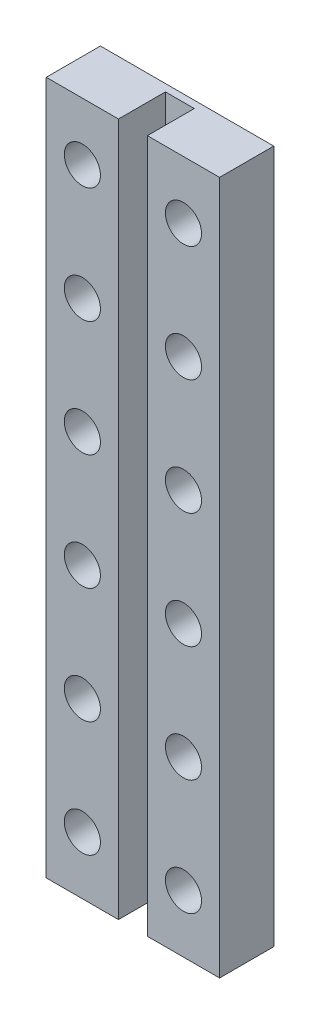
ISO-10303-21;
HEADER;
FILE_DESCRIPTION(('STEP AP214'),'2;1');
FILE_NAME('part.step','',(''),(''),'','','');
FILE_SCHEMA(('AUTOMOTIVE_DESIGN { 1 0 10303 214 1 1 1 1 }'));
ENDSEC;
DATA;
#1=APPLICATION_CONTEXT('core data for automotive mechanical design processes');
#2=APPLICATION_PROTOCOL_DEFINITION('international standard','automotive_design',2000,#1);
#3=PRODUCT_CONTEXT('',#1,'mechanical');
#4=PRODUCT('Part','Part','',(#3));
#5=PRODUCT_RELATED_PRODUCT_CATEGORY('part','',(#4));
#6=PRODUCT_DEFINITION_FORMATION('','',#4);
#7=PRODUCT_DEFINITION_CONTEXT('part definition',#1,'design');
#8=PRODUCT_DEFINITION('design','',#6,#7);
#9=PRODUCT_DEFINITION_SHAPE('','',#8);
#10=(LENGTH_UNIT() NAMED_UNIT(*) SI_UNIT(.MILLI.,.METRE.));
#11=(NAMED_UNIT(*) PLANE_ANGLE_UNIT() SI_UNIT($,.RADIAN.));
#12=(NAMED_UNIT(*) SI_UNIT($,.STERADIAN.) SOLID_ANGLE_UNIT());
#13=UNCERTAINTY_MEASURE_WITH_UNIT(LENGTH_MEASURE(1.E-05),#10,'distance_accuracy_value','');
#14=(GEOMETRIC_REPRESENTATION_CONTEXT(3) GLOBAL_UNCERTAINTY_ASSIGNED_CONTEXT((#13)) GLOBAL_UNIT_ASSIGNED_CONTEXT((#10,
#11,#12)) REPRESENTATION_CONTEXT('',''));
#15=CARTESIAN_POINT('',(0.,0.,0.));
#16=DIRECTION('',(0.,0.,1.));
#17=DIRECTION('',(1.,0.,0.));
#18=AXIS2_PLACEMENT_3D('',#15,#16,#17);
#19=CARTESIAN_POINT('',(-2.,-96.,3.75));
#20=DIRECTION('',(0.,0.,1.));
#21=DIRECTION('',(1.,0.,0.));
#22=AXIS2_PLACEMENT_3D('',#19,#20,#21);
#23=PLANE('',#22);
#24=CARTESIAN_POINT('',(-6.99999999999916,-88.,3.75));
#25=DIRECTION('',(0.,0.,1.));
#26=DIRECTION('',(1.,0.,0.));
#27=AXIS2_PLACEMENT_3D('',#24,#25,#26);
#28=CIRCLE('',#27,2.5);
#29=CARTESIAN_POINT('',(-4.49999999999916,-88.,3.75));
#30=VERTEX_POINT('',#29);
#31=EDGE_CURVE('E252',#30,#30,#28,.T.);
#32=ORIENTED_EDGE('',*,*,#31,.F.);
#33=EDGE_LOOP('',(#32));
#34=FACE_BOUND('',#33,.T.);
#35=CARTESIAN_POINT('',(-6.99999999999933,-72.,3.75));
#36=DIRECTION('',(0.,0.,1.));
#37=DIRECTION('',(1.,0.,0.));
#38=AXIS2_PLACEMENT_3D('',#35,#36,#37);
#39=CIRCLE('',#38,2.5);
#40=CARTESIAN_POINT('',(-4.49999999999933,-72.,3.75));
#41=VERTEX_POINT('',#40);
#42=EDGE_CURVE('E254',#41,#41,#39,.T.);
#43=ORIENTED_EDGE('',*,*,#42,.F.);
#44=EDGE_LOOP('',(#43));
#45=FACE_BOUND('',#44,.T.);
#46=CARTESIAN_POINT('',(-6.99999999999949,-56.,3.75));
#47=DIRECTION('',(0.,0.,1.));
#48=DIRECTION('',(1.,0.,0.));
#49=AXIS2_PLACEMENT_3D('',#46,#47,#48);
#50=CIRCLE('',#49,2.5);
#51=CARTESIAN_POINT('',(-4.49999999999949,-56.,3.75));
#52=VERTEX_POINT('',#51);
#53=EDGE_CURVE('E260',#52,#52,#50,.T.);
#54=ORIENTED_EDGE('',*,*,#53,.F.);
#55=EDGE_LOOP('',(#54));
#56=FACE_BOUND('',#55,.T.);
#57=CARTESIAN_POINT('',(-6.99999999999966,-40.,3.75));
#58=DIRECTION('',(0.,0.,1.));
#59=DIRECTION('',(1.,0.,0.));
#60=AXIS2_PLACEMENT_3D('',#57,#58,#59);
#61=CIRCLE('',#60,2.5);
#62=CARTESIAN_POINT('',(-4.49999999999966,-40.,3.75));
#63=VERTEX_POINT('',#62);
#64=EDGE_CURVE('E266',#63,#63,#61,.T.);
#65=ORIENTED_EDGE('',*,*,#64,.F.);
#66=EDGE_LOOP('',(#65));
#67=FACE_BOUND('',#66,.T.);
#68=CARTESIAN_POINT('',(-6.99999999999983,-24.,3.75));
#69=DIRECTION('',(0.,0.,1.));
#70=DIRECTION('',(1.,0.,0.));
#71=AXIS2_PLACEMENT_3D('',#68,#69,#70);
#72=CIRCLE('',#71,2.5);
#73=CARTESIAN_POINT('',(-4.49999999999983,-24.,3.75));
#74=VERTEX_POINT('',#73);
#75=EDGE_CURVE('E272',#74,#74,#72,.T.);
#76=ORIENTED_EDGE('',*,*,#75,.F.);
#77=EDGE_LOOP('',(#76));
#78=FACE_BOUND('',#77,.T.);
#79=CARTESIAN_POINT('',(-7.,-8.,3.75));
#80=DIRECTION('',(0.,0.,1.));
#81=DIRECTION('',(1.,0.,0.));
#82=AXIS2_PLACEMENT_3D('',#79,#80,#81);
#83=CIRCLE('',#82,2.5);
#84=CARTESIAN_POINT('',(-4.5,-8.,3.75));
#85=VERTEX_POINT('',#84);
#86=EDGE_CURVE('E314',#85,#85,#83,.T.);
#87=ORIENTED_EDGE('',*,*,#86,.F.);
#88=EDGE_LOOP('',(#87));
#89=FACE_BOUND('',#88,.T.);
#90=DIRECTION('',(1.,0.,0.));
#91=VECTOR('',#90,1.);
#92=CARTESIAN_POINT('',(-2.,0.,3.75));
#93=LINE('',#92,#91);
#94=CARTESIAN_POINT('',(-12.,0.,3.75));
#95=VERTEX_POINT('',#94);
#96=CARTESIAN_POINT('',(-2.,0.,3.75));
#97=VERTEX_POINT('',#96);
#98=EDGE_CURVE('E130',#95,#97,#93,.T.);
#99=ORIENTED_EDGE('',*,*,#98,.F.);
#100=DIRECTION('',(0.,1.,0.));
#101=VECTOR('',#100,1.);
#102=CARTESIAN_POINT('',(-12.,-96.,3.75));
#103=LINE('',#102,#101);
#104=CARTESIAN_POINT('',(-12.,-96.,3.75));
#105=VERTEX_POINT('',#104);
#106=EDGE_CURVE('E11',#105,#95,#103,.T.);
#107=ORIENTED_EDGE('',*,*,#106,.F.);
#108=DIRECTION('',(1.,0.,0.));
#109=VECTOR('',#108,1.);
#110=CARTESIAN_POINT('',(-2.,-96.,3.75));
#111=LINE('',#110,#109);
#112=CARTESIAN_POINT('',(-2.,-96.,3.75));
#113=VERTEX_POINT('',#112);
#114=EDGE_CURVE('E151',#105,#113,#111,.T.);
#115=ORIENTED_EDGE('',*,*,#114,.T.);
#116=DIRECTION('',(0.,1.,0.));
#117=VECTOR('',#116,1.);
#118=CARTESIAN_POINT('',(-2.,-96.,3.75));
#119=LINE('',#118,#117);
#120=EDGE_CURVE('E36',#113,#97,#119,.T.);
#121=ORIENTED_EDGE('',*,*,#120,.T.);
#122=EDGE_LOOP('',(#99,#107,#115,#121));
#123=FACE_BOUND('',#122,.T.);
#124=ADVANCED_FACE('F33',(#34,#45,#56,#67,#78,#89,#123),#23,.T.);
#125=CARTESIAN_POINT('',(-12.,-96.,-3.75));
#126=DIRECTION('',(-1.,0.,0.));
#127=DIRECTION('',(0.,0.,1.));
#128=AXIS2_PLACEMENT_3D('',#125,#126,#127);
#129=PLANE('',#128);
#130=DIRECTION('',(0.,0.,1.));
#131=VECTOR('',#130,1.);
#132=CARTESIAN_POINT('',(-12.,0.,-3.75));
#133=LINE('',#132,#131);
#134=CARTESIAN_POINT('',(-12.,0.,-3.75));
#135=VERTEX_POINT('',#134);
#136=EDGE_CURVE('E149',#135,#95,#133,.T.);
#137=ORIENTED_EDGE('',*,*,#136,.F.);
#138=DIRECTION('',(0.,1.,0.));
#139=VECTOR('',#138,1.);
#140=CARTESIAN_POINT('',(-12.,-96.,-3.75));
#141=LINE('',#140,#139);
#142=CARTESIAN_POINT('',(-12.,-96.,-3.75));
#143=VERTEX_POINT('',#142);
#144=EDGE_CURVE('E42',#143,#135,#141,.T.);
#145=ORIENTED_EDGE('',*,*,#144,.F.);
#146=DIRECTION('',(0.,0.,1.));
#147=VECTOR('',#146,1.);
#148=CARTESIAN_POINT('',(-12.,-96.,-3.75));
#149=LINE('',#148,#147);
#150=EDGE_CURVE('E120',#143,#105,#149,.T.);
#151=ORIENTED_EDGE('',*,*,#150,.T.);
#152=ORIENTED_EDGE('',*,*,#106,.T.);
#153=EDGE_LOOP('',(#137,#145,#151,#152));
#154=FACE_BOUND('',#153,.T.);
#155=ADVANCED_FACE('F163',(#154),#129,.T.);
#156=CARTESIAN_POINT('',(12.,-96.,-3.75));
#157=DIRECTION('',(0.,0.,-1.));
#158=DIRECTION('',(-1.,0.,0.));
#159=AXIS2_PLACEMENT_3D('',#156,#157,#158);
#160=PLANE('',#159);
#161=CARTESIAN_POINT('',(-6.99999999999916,-88.,-3.75));
#162=DIRECTION('',(0.,0.,1.));
#163=DIRECTION('',(1.,0.,0.));
#164=AXIS2_PLACEMENT_3D('',#161,#162,#163);
#165=CIRCLE('',#164,2.5);
#166=CARTESIAN_POINT('',(-4.49999999999916,-88.,-3.75));
#167=VERTEX_POINT('',#166);
#168=EDGE_CURVE('E249',#167,#167,#165,.T.);
#169=ORIENTED_EDGE('',*,*,#168,.T.);
#170=EDGE_LOOP('',(#169));
#171=FACE_BOUND('',#170,.T.);
#172=CARTESIAN_POINT('',(-6.99999999999933,-72.,-3.75));
#173=DIRECTION('',(0.,0.,1.));
#174=DIRECTION('',(1.,0.,0.));
#175=AXIS2_PLACEMENT_3D('',#172,#173,#174);
#176=CIRCLE('',#175,2.5);
#177=CARTESIAN_POINT('',(-4.49999999999933,-72.,-3.75));
#178=VERTEX_POINT('',#177);
#179=EDGE_CURVE('E257',#178,#178,#176,.T.);
#180=ORIENTED_EDGE('',*,*,#179,.T.);
#181=EDGE_LOOP('',(#180));
#182=FACE_BOUND('',#181,.T.);
#183=CARTESIAN_POINT('',(-6.99999999999949,-56.,-3.75));
#184=DIRECTION('',(0.,0.,1.));
#185=DIRECTION('',(1.,0.,0.));
#186=AXIS2_PLACEMENT_3D('',#183,#184,#185);
#187=CIRCLE('',#186,2.5);
#188=CARTESIAN_POINT('',(-4.49999999999949,-56.,-3.75));
#189=VERTEX_POINT('',#188);
#190=EDGE_CURVE('E263',#189,#189,#187,.T.);
#191=ORIENTED_EDGE('',*,*,#190,.T.);
#192=EDGE_LOOP('',(#191));
#193=FACE_BOUND('',#192,.T.);
#194=CARTESIAN_POINT('',(-6.99999999999966,-40.,-3.75));
#195=DIRECTION('',(0.,0.,1.));
#196=DIRECTION('',(1.,0.,0.));
#197=AXIS2_PLACEMENT_3D('',#194,#195,#196);
#198=CIRCLE('',#197,2.5);
#199=CARTESIAN_POINT('',(-4.49999999999966,-40.,-3.75));
#200=VERTEX_POINT('',#199);
#201=EDGE_CURVE('E269',#200,#200,#198,.T.);
#202=ORIENTED_EDGE('',*,*,#201,.T.);
#203=EDGE_LOOP('',(#202));
#204=FACE_BOUND('',#203,.T.);
#205=CARTESIAN_POINT('',(-6.99999999999983,-24.,-3.75));
#206=DIRECTION('',(0.,0.,1.));
#207=DIRECTION('',(1.,0.,0.));
#208=AXIS2_PLACEMENT_3D('',#205,#206,#207);
#209=CIRCLE('',#208,2.5);
#210=CARTESIAN_POINT('',(-4.49999999999983,-24.,-3.75));
#211=VERTEX_POINT('',#210);
#212=EDGE_CURVE('E275',#211,#211,#209,.T.);
#213=ORIENTED_EDGE('',*,*,#212,.T.);
#214=EDGE_LOOP('',(#213));
#215=FACE_BOUND('',#214,.T.);
#216=CARTESIAN_POINT('',(7.00000000000084,-88.,-3.75));
#217=DIRECTION('',(0.,0.,1.));
#218=DIRECTION('',(1.,0.,0.));
#219=AXIS2_PLACEMENT_3D('',#216,#217,#218);
#220=CIRCLE('',#219,2.5);
#221=CARTESIAN_POINT('',(9.50000000000084,-88.,-3.75));
#222=VERTEX_POINT('',#221);
#223=EDGE_CURVE('E281',#222,#222,#220,.T.);
#224=ORIENTED_EDGE('',*,*,#223,.T.);
#225=EDGE_LOOP('',(#224));
#226=FACE_BOUND('',#225,.T.);
#227=CARTESIAN_POINT('',(7.00000000000067,-72.,-3.75));
#228=DIRECTION('',(0.,0.,1.));
#229=DIRECTION('',(1.,0.,0.));
#230=AXIS2_PLACEMENT_3D('',#227,#228,#229);
#231=CIRCLE('',#230,2.5);
#232=CARTESIAN_POINT('',(9.50000000000067,-72.,-3.75));
#233=VERTEX_POINT('',#232);
#234=EDGE_CURVE('E287',#233,#233,#231,.T.);
#235=ORIENTED_EDGE('',*,*,#234,.T.);
#236=EDGE_LOOP('',(#235));
#237=FACE_BOUND('',#236,.T.);
#238=CARTESIAN_POINT('',(7.00000000000051,-56.,-3.75));
#239=DIRECTION('',(0.,0.,1.));
#240=DIRECTION('',(1.,0.,0.));
#241=AXIS2_PLACEMENT_3D('',#238,#239,#240);
#242=CIRCLE('',#241,2.5);
#243=CARTESIAN_POINT('',(9.5000000000005,-56.,-3.75));
#244=VERTEX_POINT('',#243);
#245=EDGE_CURVE('E293',#244,#244,#242,.T.);
#246=ORIENTED_EDGE('',*,*,#245,.T.);
#247=EDGE_LOOP('',(#246));
#248=FACE_BOUND('',#247,.T.);
#249=CARTESIAN_POINT('',(7.00000000000034,-40.,-3.75));
#250=DIRECTION('',(0.,0.,1.));
#251=DIRECTION('',(1.,0.,0.));
#252=AXIS2_PLACEMENT_3D('',#249,#250,#251);
#253=CIRCLE('',#252,2.5);
#254=CARTESIAN_POINT('',(9.50000000000034,-40.,-3.75));
#255=VERTEX_POINT('',#254);
#256=EDGE_CURVE('E299',#255,#255,#253,.T.);
#257=ORIENTED_EDGE('',*,*,#256,.T.);
#258=EDGE_LOOP('',(#257));
#259=FACE_BOUND('',#258,.T.);
#260=CARTESIAN_POINT('',(7.00000000000017,-24.,-3.75));
#261=DIRECTION('',(0.,0.,1.));
#262=DIRECTION('',(1.,0.,0.));
#263=AXIS2_PLACEMENT_3D('',#260,#261,#262);
#264=CIRCLE('',#263,2.5);
#265=CARTESIAN_POINT('',(9.50000000000017,-24.,-3.75));
#266=VERTEX_POINT('',#265);
#267=EDGE_CURVE('E305',#266,#266,#264,.T.);
#268=ORIENTED_EDGE('',*,*,#267,.T.);
#269=EDGE_LOOP('',(#268));
#270=FACE_BOUND('',#269,.T.);
#271=CARTESIAN_POINT('',(7.,-8.,-3.75));
#272=DIRECTION('',(0.,0.,1.));
#273=DIRECTION('',(1.,0.,0.));
#274=AXIS2_PLACEMENT_3D('',#271,#272,#273);
#275=CIRCLE('',#274,2.5);
#276=CARTESIAN_POINT('',(9.5,-8.,-3.75));
#277=VERTEX_POINT('',#276);
#278=EDGE_CURVE('E311',#277,#277,#275,.T.);
#279=ORIENTED_EDGE('',*,*,#278,.T.);
#280=EDGE_LOOP('',(#279));
#281=FACE_BOUND('',#280,.T.);
#282=CARTESIAN_POINT('',(-7.,-8.,-3.75));
#283=DIRECTION('',(0.,0.,1.));
#284=DIRECTION('',(1.,0.,0.));
#285=AXIS2_PLACEMENT_3D('',#282,#283,#284);
#286=CIRCLE('',#285,2.5);
#287=CARTESIAN_POINT('',(-4.5,-8.,-3.75));
#288=VERTEX_POINT('',#287);
#289=EDGE_CURVE('E134',#288,#288,#286,.T.);
#290=ORIENTED_EDGE('',*,*,#289,.T.);
#291=EDGE_LOOP('',(#290));
#292=FACE_BOUND('',#291,.T.);
#293=DIRECTION('',(-1.,0.,0.));
#294=VECTOR('',#293,1.);
#295=CARTESIAN_POINT('',(12.,0.,-3.75));
#296=LINE('',#295,#294);
#297=CARTESIAN_POINT('',(12.,0.,-3.75));
#298=VERTEX_POINT('',#297);
#299=EDGE_CURVE('E107',#298,#135,#296,.T.);
#300=ORIENTED_EDGE('',*,*,#299,.F.);
#301=DIRECTION('',(0.,1.,0.));
#302=VECTOR('',#301,1.);
#303=CARTESIAN_POINT('',(12.,-96.,-3.75));
#304=LINE('',#303,#302);
#305=CARTESIAN_POINT('',(12.,-96.,-3.75));
#306=VERTEX_POINT('',#305);
#307=EDGE_CURVE('E102',#306,#298,#304,.T.);
#308=ORIENTED_EDGE('',*,*,#307,.F.);
#309=DIRECTION('',(-1.,0.,0.));
#310=VECTOR('',#309,1.);
#311=CARTESIAN_POINT('',(12.,-96.,-3.75));
#312=LINE('',#311,#310);
#313=EDGE_CURVE('E105',#306,#143,#312,.T.);
#314=ORIENTED_EDGE('',*,*,#313,.T.);
#315=ORIENTED_EDGE('',*,*,#144,.T.);
#316=EDGE_LOOP('',(#300,#308,#314,#315));
#317=FACE_BOUND('',#316,.T.);
#318=ADVANCED_FACE('F104',(#171,#182,#193,#204,#215,#226,#237,#248,#259,#270,#281,#292,#317),
#160,.T.);
#319=CARTESIAN_POINT('',(12.,-96.,-3.75));
#320=DIRECTION('',(1.,0.,0.));
#321=DIRECTION('',(0.,0.,-1.));
#322=AXIS2_PLACEMENT_3D('',#319,#320,#321);
#323=PLANE('',#322);
#324=DIRECTION('',(0.,0.,-1.));
#325=VECTOR('',#324,1.);
#326=CARTESIAN_POINT('',(12.,0.,-3.75));
#327=LINE('',#326,#325);
#328=CARTESIAN_POINT('',(12.,0.,3.75));
#329=VERTEX_POINT('',#328);
#330=EDGE_CURVE('E146',#329,#298,#327,.T.);
#331=ORIENTED_EDGE('',*,*,#330,.F.);
#332=DIRECTION('',(0.,1.,0.));
#333=VECTOR('',#332,1.);
#334=CARTESIAN_POINT('',(12.,-96.,3.75));
#335=LINE('',#334,#333);
#336=CARTESIAN_POINT('',(12.,-96.,3.75));
#337=VERTEX_POINT('',#336);
#338=EDGE_CURVE('E112',#337,#329,#335,.T.);
#339=ORIENTED_EDGE('',*,*,#338,.F.);
#340=DIRECTION('',(0.,0.,-1.));
#341=VECTOR('',#340,1.);
#342=CARTESIAN_POINT('',(12.,-96.,-3.75));
#343=LINE('',#342,#341);
#344=EDGE_CURVE('E118',#337,#306,#343,.T.);
#345=ORIENTED_EDGE('',*,*,#344,.T.);
#346=ORIENTED_EDGE('',*,*,#307,.T.);
#347=EDGE_LOOP('',(#331,#339,#345,#346));
#348=FACE_BOUND('',#347,.T.);
#349=ADVANCED_FACE('F122',(#348),#323,.T.);
#350=CARTESIAN_POINT('',(12.,-96.,3.75));
#351=DIRECTION('',(0.,0.,1.));
#352=DIRECTION('',(1.,0.,0.));
#353=AXIS2_PLACEMENT_3D('',#350,#351,#352);
#354=PLANE('',#353);
#355=CARTESIAN_POINT('',(7.00000000000084,-88.,3.75));
#356=DIRECTION('',(0.,0.,1.));
#357=DIRECTION('',(1.,0.,0.));
#358=AXIS2_PLACEMENT_3D('',#355,#356,#357);
#359=CIRCLE('',#358,2.5);
#360=CARTESIAN_POINT('',(9.50000000000084,-88.,3.75));
#361=VERTEX_POINT('',#360);
#362=EDGE_CURVE('E278',#361,#361,#359,.T.);
#363=ORIENTED_EDGE('',*,*,#362,.F.);
#364=EDGE_LOOP('',(#363));
#365=FACE_BOUND('',#364,.T.);
#366=CARTESIAN_POINT('',(7.00000000000067,-72.,3.75));
#367=DIRECTION('',(0.,0.,1.));
#368=DIRECTION('',(1.,0.,0.));
#369=AXIS2_PLACEMENT_3D('',#366,#367,#368);
#370=CIRCLE('',#369,2.5);
#371=CARTESIAN_POINT('',(9.50000000000067,-72.,3.75));
#372=VERTEX_POINT('',#371);
#373=EDGE_CURVE('E284',#372,#372,#370,.T.);
#374=ORIENTED_EDGE('',*,*,#373,.F.);
#375=EDGE_LOOP('',(#374));
#376=FACE_BOUND('',#375,.T.);
#377=CARTESIAN_POINT('',(7.00000000000051,-56.,3.75));
#378=DIRECTION('',(0.,0.,1.));
#379=DIRECTION('',(1.,0.,0.));
#380=AXIS2_PLACEMENT_3D('',#377,#378,#379);
#381=CIRCLE('',#380,2.5);
#382=CARTESIAN_POINT('',(9.5000000000005,-56.,3.75));
#383=VERTEX_POINT('',#382);
#384=EDGE_CURVE('E290',#383,#383,#381,.T.);
#385=ORIENTED_EDGE('',*,*,#384,.F.);
#386=EDGE_LOOP('',(#385));
#387=FACE_BOUND('',#386,.T.);
#388=CARTESIAN_POINT('',(7.00000000000034,-40.,3.75));
#389=DIRECTION('',(0.,0.,1.));
#390=DIRECTION('',(1.,0.,0.));
#391=AXIS2_PLACEMENT_3D('',#388,#389,#390);
#392=CIRCLE('',#391,2.5);
#393=CARTESIAN_POINT('',(9.50000000000034,-40.,3.75));
#394=VERTEX_POINT('',#393);
#395=EDGE_CURVE('E296',#394,#394,#392,.T.);
#396=ORIENTED_EDGE('',*,*,#395,.F.);
#397=EDGE_LOOP('',(#396));
#398=FACE_BOUND('',#397,.T.);
#399=CARTESIAN_POINT('',(7.00000000000017,-24.,3.75));
#400=DIRECTION('',(0.,0.,1.));
#401=DIRECTION('',(1.,0.,0.));
#402=AXIS2_PLACEMENT_3D('',#399,#400,#401);
#403=CIRCLE('',#402,2.5);
#404=CARTESIAN_POINT('',(9.50000000000017,-24.,3.75));
#405=VERTEX_POINT('',#404);
#406=EDGE_CURVE('E302',#405,#405,#403,.T.);
#407=ORIENTED_EDGE('',*,*,#406,.F.);
#408=EDGE_LOOP('',(#407));
#409=FACE_BOUND('',#408,.T.);
#410=CARTESIAN_POINT('',(7.,-8.,3.75));
#411=DIRECTION('',(0.,0.,1.));
#412=DIRECTION('',(1.,0.,0.));
#413=AXIS2_PLACEMENT_3D('',#410,#411,#412);
#414=CIRCLE('',#413,2.5);
#415=CARTESIAN_POINT('',(9.5,-8.,3.75));
#416=VERTEX_POINT('',#415);
#417=EDGE_CURVE('E308',#416,#416,#414,.T.);
#418=ORIENTED_EDGE('',*,*,#417,.F.);
#419=EDGE_LOOP('',(#418));
#420=FACE_BOUND('',#419,.T.);
#421=DIRECTION('',(1.,0.,0.));
#422=VECTOR('',#421,1.);
#423=CARTESIAN_POINT('',(12.,0.,3.75));
#424=LINE('',#423,#422);
#425=CARTESIAN_POINT('',(2.,0.,3.75));
#426=VERTEX_POINT('',#425);
#427=EDGE_CURVE('E143',#426,#329,#424,.T.);
#428=ORIENTED_EDGE('',*,*,#427,.F.);
#429=DIRECTION('',(0.,1.,0.));
#430=VECTOR('',#429,1.);
#431=CARTESIAN_POINT('',(2.,-96.,3.75));
#432=LINE('',#431,#430);
#433=CARTESIAN_POINT('',(2.,-96.,3.75));
#434=VERTEX_POINT('',#433);
#435=EDGE_CURVE('E155',#434,#426,#432,.T.);
#436=ORIENTED_EDGE('',*,*,#435,.F.);
#437=DIRECTION('',(1.,0.,0.));
#438=VECTOR('',#437,1.);
#439=CARTESIAN_POINT('',(12.,-96.,3.75));
#440=LINE('',#439,#438);
#441=EDGE_CURVE('E123',#434,#337,#440,.T.);
#442=ORIENTED_EDGE('',*,*,#441,.T.);
#443=ORIENTED_EDGE('',*,*,#338,.T.);
#444=EDGE_LOOP('',(#428,#436,#442,#443));
#445=FACE_BOUND('',#444,.T.);
#446=ADVANCED_FACE('F178',(#365,#376,#387,#398,#409,#420,#445),#354,.T.);
#447=CARTESIAN_POINT('',(2.,-96.,-2.75));
#448=DIRECTION('',(-1.,0.,0.));
#449=DIRECTION('',(0.,0.,1.));
#450=AXIS2_PLACEMENT_3D('',#447,#448,#449);
#451=PLANE('',#450);
#452=DIRECTION('',(0.,0.,1.));
#453=VECTOR('',#452,1.);
#454=CARTESIAN_POINT('',(2.,0.,-2.75));
#455=LINE('',#454,#453);
#456=CARTESIAN_POINT('',(2.,0.,-2.75));
#457=VERTEX_POINT('',#456);
#458=EDGE_CURVE('E140',#457,#426,#455,.T.);
#459=ORIENTED_EDGE('',*,*,#458,.F.);
#460=DIRECTION('',(0.,1.,0.));
#461=VECTOR('',#460,1.);
#462=CARTESIAN_POINT('',(2.,-96.,-2.75));
#463=LINE('',#462,#461);
#464=CARTESIAN_POINT('',(2.,-96.,-2.75));
#465=VERTEX_POINT('',#464);
#466=EDGE_CURVE('E157',#465,#457,#463,.T.);
#467=ORIENTED_EDGE('',*,*,#466,.F.);
#468=DIRECTION('',(0.,0.,1.));
#469=VECTOR('',#468,1.);
#470=CARTESIAN_POINT('',(2.,-96.,-2.75));
#471=LINE('',#470,#469);
#472=EDGE_CURVE('E125',#465,#434,#471,.T.);
#473=ORIENTED_EDGE('',*,*,#472,.T.);
#474=ORIENTED_EDGE('',*,*,#435,.T.);
#475=EDGE_LOOP('',(#459,#467,#473,#474));
#476=FACE_BOUND('',#475,.T.);
#477=ADVANCED_FACE('F181',(#476),#451,.T.);
#478=CARTESIAN_POINT('',(-2.,-96.,-2.75));
#479=DIRECTION('',(0.,0.,1.));
#480=DIRECTION('',(1.,0.,0.));
#481=AXIS2_PLACEMENT_3D('',#478,#479,#480);
#482=PLANE('',#481);
#483=DIRECTION('',(1.,0.,0.));
#484=VECTOR('',#483,1.);
#485=CARTESIAN_POINT('',(-2.,0.,-2.75));
#486=LINE('',#485,#484);
#487=CARTESIAN_POINT('',(-2.,0.,-2.75));
#488=VERTEX_POINT('',#487);
#489=EDGE_CURVE('E137',#488,#457,#486,.T.);
#490=ORIENTED_EDGE('',*,*,#489,.F.);
#491=DIRECTION('',(0.,1.,0.));
#492=VECTOR('',#491,1.);
#493=CARTESIAN_POINT('',(-2.,-96.,-2.75));
#494=LINE('',#493,#492);
#495=CARTESIAN_POINT('',(-2.,-96.,-2.75));
#496=VERTEX_POINT('',#495);
#497=EDGE_CURVE('E158',#496,#488,#494,.T.);
#498=ORIENTED_EDGE('',*,*,#497,.F.);
#499=DIRECTION('',(1.,0.,0.));
#500=VECTOR('',#499,1.);
#501=CARTESIAN_POINT('',(-2.,-96.,-2.75));
#502=LINE('',#501,#500);
#503=EDGE_CURVE('E324',#496,#465,#502,.T.);
#504=ORIENTED_EDGE('',*,*,#503,.T.);
#505=ORIENTED_EDGE('',*,*,#466,.T.);
#506=EDGE_LOOP('',(#490,#498,#504,#505));
#507=FACE_BOUND('',#506,.T.);
#508=ADVANCED_FACE('F185',(#507),#482,.T.);
#509=CARTESIAN_POINT('',(-2.,-96.,3.75));
#510=DIRECTION('',(1.,0.,0.));
#511=DIRECTION('',(0.,0.,-1.));
#512=AXIS2_PLACEMENT_3D('',#509,#510,#511);
#513=PLANE('',#512);
#514=DIRECTION('',(0.,0.,-1.));
#515=VECTOR('',#514,1.);
#516=CARTESIAN_POINT('',(-2.,0.,3.75));
#517=LINE('',#516,#515);
#518=EDGE_CURVE('E133',#97,#488,#517,.T.);
#519=ORIENTED_EDGE('',*,*,#518,.F.);
#520=ORIENTED_EDGE('',*,*,#120,.F.);
#521=DIRECTION('',(0.,0.,-1.));
#522=VECTOR('',#521,1.);
#523=CARTESIAN_POINT('',(-2.,-96.,3.75));
#524=LINE('',#523,#522);
#525=EDGE_CURVE('E322',#113,#496,#524,.T.);
#526=ORIENTED_EDGE('',*,*,#525,.T.);
#527=ORIENTED_EDGE('',*,*,#497,.T.);
#528=EDGE_LOOP('',(#519,#520,#526,#527));
#529=FACE_BOUND('',#528,.T.);
#530=ADVANCED_FACE('F160',(#529),#513,.T.);
#531=CARTESIAN_POINT('',(0.,-96.,0.));
#532=DIRECTION('',(0.,1.,0.));
#533=DIRECTION('',(0.,0.,1.));
#534=AXIS2_PLACEMENT_3D('',#531,#532,#533);
#535=PLANE('',#534);
#536=ORIENTED_EDGE('',*,*,#114,.F.);
#537=ORIENTED_EDGE('',*,*,#150,.F.);
#538=ORIENTED_EDGE('',*,*,#313,.F.);
#539=ORIENTED_EDGE('',*,*,#344,.F.);
#540=ORIENTED_EDGE('',*,*,#441,.F.);
#541=ORIENTED_EDGE('',*,*,#472,.F.);
#542=ORIENTED_EDGE('',*,*,#503,.F.);
#543=ORIENTED_EDGE('',*,*,#525,.F.);
#544=EDGE_LOOP('',(#536,#537,#538,#539,#540,#541,#542,#543));
#545=FACE_BOUND('',#544,.T.);
#546=ADVANCED_FACE('F116',(#545),#535,.F.);
#547=CARTESIAN_POINT('',(0.,0.,0.));
#548=DIRECTION('',(0.,1.,0.));
#549=DIRECTION('',(0.,0.,1.));
#550=AXIS2_PLACEMENT_3D('',#547,#548,#549);
#551=PLANE('',#550);
#552=ORIENTED_EDGE('',*,*,#98,.T.);
#553=ORIENTED_EDGE('',*,*,#518,.T.);
#554=ORIENTED_EDGE('',*,*,#489,.T.);
#555=ORIENTED_EDGE('',*,*,#458,.T.);
#556=ORIENTED_EDGE('',*,*,#427,.T.);
#557=ORIENTED_EDGE('',*,*,#330,.T.);
#558=ORIENTED_EDGE('',*,*,#299,.T.);
#559=ORIENTED_EDGE('',*,*,#136,.T.);
#560=EDGE_LOOP('',(#552,#553,#554,#555,#556,#557,#558,#559));
#561=FACE_BOUND('',#560,.T.);
#562=ADVANCED_FACE('F162',(#561),#551,.T.);
#563=CARTESIAN_POINT('',(-7.,-8.,-3.75));
#564=DIRECTION('',(0.,0.,1.));
#565=DIRECTION('',(1.,0.,0.));
#566=AXIS2_PLACEMENT_3D('',#563,#564,#565);
#567=CYLINDRICAL_SURFACE('',#566,2.5);
#568=ORIENTED_EDGE('',*,*,#289,.F.);
#569=EDGE_LOOP('',(#568));
#570=FACE_BOUND('',#569,.T.);
#571=ORIENTED_EDGE('',*,*,#86,.T.);
#572=EDGE_LOOP('',(#571));
#573=FACE_BOUND('',#572,.T.);
#574=ADVANCED_FACE('F196',(#570,#573),#567,.F.);
#575=CARTESIAN_POINT('',(7.,-8.,-3.75));
#576=DIRECTION('',(0.,0.,1.));
#577=DIRECTION('',(1.,0.,0.));
#578=AXIS2_PLACEMENT_3D('',#575,#576,#577);
#579=CYLINDRICAL_SURFACE('',#578,2.5);
#580=ORIENTED_EDGE('',*,*,#278,.F.);
#581=EDGE_LOOP('',(#580));
#582=FACE_BOUND('',#581,.T.);
#583=ORIENTED_EDGE('',*,*,#417,.T.);
#584=EDGE_LOOP('',(#583));
#585=FACE_BOUND('',#584,.T.);
#586=ADVANCED_FACE('F200',(#582,#585),#579,.F.);
#587=CARTESIAN_POINT('',(7.00000000000017,-24.,-3.75));
#588=DIRECTION('',(0.,0.,1.));
#589=DIRECTION('',(1.,0.,0.));
#590=AXIS2_PLACEMENT_3D('',#587,#588,#589);
#591=CYLINDRICAL_SURFACE('',#590,2.5);
#592=ORIENTED_EDGE('',*,*,#267,.F.);
#593=EDGE_LOOP('',(#592));
#594=FACE_BOUND('',#593,.T.);
#595=ORIENTED_EDGE('',*,*,#406,.T.);
#596=EDGE_LOOP('',(#595));
#597=FACE_BOUND('',#596,.T.);
#598=ADVANCED_FACE('F204',(#594,#597),#591,.F.);
#599=CARTESIAN_POINT('',(7.00000000000034,-40.,-3.75));
#600=DIRECTION('',(0.,0.,1.));
#601=DIRECTION('',(1.,0.,0.));
#602=AXIS2_PLACEMENT_3D('',#599,#600,#601);
#603=CYLINDRICAL_SURFACE('',#602,2.5);
#604=ORIENTED_EDGE('',*,*,#256,.F.);
#605=EDGE_LOOP('',(#604));
#606=FACE_BOUND('',#605,.T.);
#607=ORIENTED_EDGE('',*,*,#395,.T.);
#608=EDGE_LOOP('',(#607));
#609=FACE_BOUND('',#608,.T.);
#610=ADVANCED_FACE('F208',(#606,#609),#603,.F.);
#611=CARTESIAN_POINT('',(7.00000000000051,-56.,-3.75));
#612=DIRECTION('',(0.,0.,1.));
#613=DIRECTION('',(1.,0.,0.));
#614=AXIS2_PLACEMENT_3D('',#611,#612,#613);
#615=CYLINDRICAL_SURFACE('',#614,2.5);
#616=ORIENTED_EDGE('',*,*,#245,.F.);
#617=EDGE_LOOP('',(#616));
#618=FACE_BOUND('',#617,.T.);
#619=ORIENTED_EDGE('',*,*,#384,.T.);
#620=EDGE_LOOP('',(#619));
#621=FACE_BOUND('',#620,.T.);
#622=ADVANCED_FACE('F212',(#618,#621),#615,.F.);
#623=CARTESIAN_POINT('',(7.00000000000067,-72.,-3.75));
#624=DIRECTION('',(0.,0.,1.));
#625=DIRECTION('',(1.,0.,0.));
#626=AXIS2_PLACEMENT_3D('',#623,#624,#625);
#627=CYLINDRICAL_SURFACE('',#626,2.5);
#628=ORIENTED_EDGE('',*,*,#234,.F.);
#629=EDGE_LOOP('',(#628));
#630=FACE_BOUND('',#629,.T.);
#631=ORIENTED_EDGE('',*,*,#373,.T.);
#632=EDGE_LOOP('',(#631));
#633=FACE_BOUND('',#632,.T.);
#634=ADVANCED_FACE('F216',(#630,#633),#627,.F.);
#635=CARTESIAN_POINT('',(7.00000000000084,-88.,-3.75));
#636=DIRECTION('',(0.,0.,1.));
#637=DIRECTION('',(1.,0.,0.));
#638=AXIS2_PLACEMENT_3D('',#635,#636,#637);
#639=CYLINDRICAL_SURFACE('',#638,2.5);
#640=ORIENTED_EDGE('',*,*,#223,.F.);
#641=EDGE_LOOP('',(#640));
#642=FACE_BOUND('',#641,.T.);
#643=ORIENTED_EDGE('',*,*,#362,.T.);
#644=EDGE_LOOP('',(#643));
#645=FACE_BOUND('',#644,.T.);
#646=ADVANCED_FACE('F220',(#642,#645),#639,.F.);
#647=CARTESIAN_POINT('',(-6.99999999999983,-24.,-3.75));
#648=DIRECTION('',(0.,0.,1.));
#649=DIRECTION('',(1.,0.,0.));
#650=AXIS2_PLACEMENT_3D('',#647,#648,#649);
#651=CYLINDRICAL_SURFACE('',#650,2.5);
#652=ORIENTED_EDGE('',*,*,#212,.F.);
#653=EDGE_LOOP('',(#652));
#654=FACE_BOUND('',#653,.T.);
#655=ORIENTED_EDGE('',*,*,#75,.T.);
#656=EDGE_LOOP('',(#655));
#657=FACE_BOUND('',#656,.T.);
#658=ADVANCED_FACE('F224',(#654,#657),#651,.F.);
#659=CARTESIAN_POINT('',(-6.99999999999966,-40.,-3.75));
#660=DIRECTION('',(0.,0.,1.));
#661=DIRECTION('',(1.,0.,0.));
#662=AXIS2_PLACEMENT_3D('',#659,#660,#661);
#663=CYLINDRICAL_SURFACE('',#662,2.5);
#664=ORIENTED_EDGE('',*,*,#201,.F.);
#665=EDGE_LOOP('',(#664));
#666=FACE_BOUND('',#665,.T.);
#667=ORIENTED_EDGE('',*,*,#64,.T.);
#668=EDGE_LOOP('',(#667));
#669=FACE_BOUND('',#668,.T.);
#670=ADVANCED_FACE('F228',(#666,#669),#663,.F.);
#671=CARTESIAN_POINT('',(-6.99999999999949,-56.,-3.75));
#672=DIRECTION('',(0.,0.,1.));
#673=DIRECTION('',(1.,0.,0.));
#674=AXIS2_PLACEMENT_3D('',#671,#672,#673);
#675=CYLINDRICAL_SURFACE('',#674,2.5);
#676=ORIENTED_EDGE('',*,*,#190,.F.);
#677=EDGE_LOOP('',(#676));
#678=FACE_BOUND('',#677,.T.);
#679=ORIENTED_EDGE('',*,*,#53,.T.);
#680=EDGE_LOOP('',(#679));
#681=FACE_BOUND('',#680,.T.);
#682=ADVANCED_FACE('F232',(#678,#681),#675,.F.);
#683=CARTESIAN_POINT('',(-6.99999999999933,-72.,-3.75));
#684=DIRECTION('',(0.,0.,1.));
#685=DIRECTION('',(1.,0.,0.));
#686=AXIS2_PLACEMENT_3D('',#683,#684,#685);
#687=CYLINDRICAL_SURFACE('',#686,2.5);
#688=ORIENTED_EDGE('',*,*,#179,.F.);
#689=EDGE_LOOP('',(#688));
#690=FACE_BOUND('',#689,.T.);
#691=ORIENTED_EDGE('',*,*,#42,.T.);
#692=EDGE_LOOP('',(#691));
#693=FACE_BOUND('',#692,.T.);
#694=ADVANCED_FACE('F236',(#690,#693),#687,.F.);
#695=CARTESIAN_POINT('',(-6.99999999999916,-88.,-3.75));
#696=DIRECTION('',(0.,0.,1.));
#697=DIRECTION('',(1.,0.,0.));
#698=AXIS2_PLACEMENT_3D('',#695,#696,#697);
#699=CYLINDRICAL_SURFACE('',#698,2.5);
#700=ORIENTED_EDGE('',*,*,#168,.F.);
#701=EDGE_LOOP('',(#700));
#702=FACE_BOUND('',#701,.T.);
#703=ORIENTED_EDGE('',*,*,#31,.T.);
#704=EDGE_LOOP('',(#703));
#705=FACE_BOUND('',#704,.T.);
#706=ADVANCED_FACE('F240',(#702,#705),#699,.F.);
#707=CLOSED_SHELL('',(#124,#155,#318,#349,#446,#477,#508,#530,#546,#562,#574,#586,#598,#610,
#622,#634,#646,#658,#670,#682,#694,#706));
#708=MANIFOLD_SOLID_BREP('B2',#707);
#709=ADVANCED_BREP_SHAPE_REPRESENTATION('',(#18,#708),#14);
#710=SHAPE_DEFINITION_REPRESENTATION(#9,#709);
ENDSEC;
END-ISO-10303-21;
